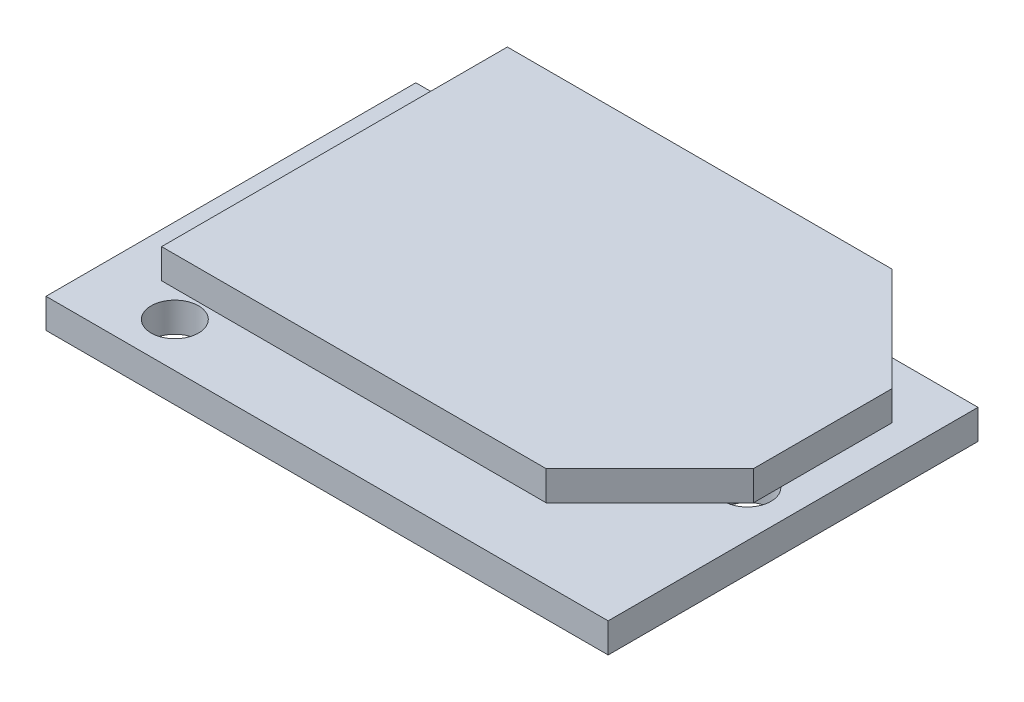
ISO-10303-21;
HEADER;
FILE_DESCRIPTION(('STEP AP214'),'2;1');
FILE_NAME('part.step','',(''),(''),'','','');
FILE_SCHEMA(('AUTOMOTIVE_DESIGN { 1 0 10303 214 1 1 1 1 }'));
ENDSEC;
DATA;
#1=APPLICATION_CONTEXT('core data for automotive mechanical design processes');
#2=APPLICATION_PROTOCOL_DEFINITION('international standard','automotive_design',2000,#1);
#3=PRODUCT_CONTEXT('',#1,'mechanical');
#4=PRODUCT('Part','Part','',(#3));
#5=PRODUCT_RELATED_PRODUCT_CATEGORY('part','',(#4));
#6=PRODUCT_DEFINITION_FORMATION('','',#4);
#7=PRODUCT_DEFINITION_CONTEXT('part definition',#1,'design');
#8=PRODUCT_DEFINITION('design','',#6,#7);
#9=PRODUCT_DEFINITION_SHAPE('','',#8);
#10=(LENGTH_UNIT() NAMED_UNIT(*) SI_UNIT(.MILLI.,.METRE.));
#11=(NAMED_UNIT(*) PLANE_ANGLE_UNIT() SI_UNIT($,.RADIAN.));
#12=(NAMED_UNIT(*) SI_UNIT($,.STERADIAN.) SOLID_ANGLE_UNIT());
#13=UNCERTAINTY_MEASURE_WITH_UNIT(LENGTH_MEASURE(1.E-05),#10,'distance_accuracy_value','');
#14=(GEOMETRIC_REPRESENTATION_CONTEXT(3) GLOBAL_UNCERTAINTY_ASSIGNED_CONTEXT((#13)) GLOBAL_UNIT_ASSIGNED_CONTEXT((#10,
#11,#12)) REPRESENTATION_CONTEXT('',''));
#15=CARTESIAN_POINT('',(0.,0.,0.));
#16=DIRECTION('',(0.,0.,1.));
#17=DIRECTION('',(1.,0.,0.));
#18=AXIS2_PLACEMENT_3D('',#15,#16,#17);
#19=CARTESIAN_POINT('',(7.,8.,-11.6864188731344));
#20=DIRECTION('',(1.,0.,0.));
#21=DIRECTION('',(0.,0.,-1.));
#22=AXIS2_PLACEMENT_3D('',#19,#20,#21);
#23=PLANE('',#22);
#24=DIRECTION('',(0.,0.,1.));
#25=VECTOR('',#24,1.);
#26=CARTESIAN_POINT('',(7.,6.,-11.6864188731344));
#27=LINE('',#26,#25);
#28=CARTESIAN_POINT('',(7.,6.,-11.6864188731344));
#29=VERTEX_POINT('',#28);
#30=CARTESIAN_POINT('',(7.,6.,11.6864188731344));
#31=VERTEX_POINT('',#30);
#32=EDGE_CURVE('E127',#29,#31,#27,.T.);
#33=ORIENTED_EDGE('',*,*,#32,.T.);
#34=DIRECTION('',(0.,-1.,0.));
#35=VECTOR('',#34,1.);
#36=CARTESIAN_POINT('',(7.,8.,11.6864188731344));
#37=LINE('',#36,#35);
#38=CARTESIAN_POINT('',(7.,8.,11.6864188731344));
#39=VERTEX_POINT('',#38);
#40=EDGE_CURVE('E12',#39,#31,#37,.T.);
#41=ORIENTED_EDGE('',*,*,#40,.F.);
#42=DIRECTION('',(0.,0.,1.));
#43=VECTOR('',#42,1.);
#44=CARTESIAN_POINT('',(7.,8.,-11.6864188731344));
#45=LINE('',#44,#43);
#46=CARTESIAN_POINT('',(7.,8.,-11.6864188731344));
#47=VERTEX_POINT('',#46);
#48=EDGE_CURVE('E137',#47,#39,#45,.T.);
#49=ORIENTED_EDGE('',*,*,#48,.F.);
#50=DIRECTION('',(0.,-1.,0.));
#51=VECTOR('',#50,1.);
#52=CARTESIAN_POINT('',(7.,8.,-11.6864188731344));
#53=LINE('',#52,#51);
#54=EDGE_CURVE('E123',#47,#29,#53,.T.);
#55=ORIENTED_EDGE('',*,*,#54,.T.);
#56=EDGE_LOOP('',(#33,#41,#49,#55));
#57=FACE_BOUND('',#56,.T.);
#58=ADVANCED_FACE('F43',(#57),#23,.F.);
#59=CARTESIAN_POINT('',(7.,8.,11.6864188731344));
#60=DIRECTION('',(0.,0.,-1.));
#61=DIRECTION('',(-1.,0.,0.));
#62=AXIS2_PLACEMENT_3D('',#59,#60,#61);
#63=PLANE('',#62);
#64=DIRECTION('',(1.,0.,0.));
#65=VECTOR('',#64,1.);
#66=CARTESIAN_POINT('',(7.,6.,11.6864188731344));
#67=LINE('',#66,#65);
#68=CARTESIAN_POINT('',(33.0000000000001,6.,11.6864188731344));
#69=VERTEX_POINT('',#68);
#70=EDGE_CURVE('E130',#31,#69,#67,.T.);
#71=ORIENTED_EDGE('',*,*,#70,.T.);
#72=DIRECTION('',(0.,-1.,0.));
#73=VECTOR('',#72,1.);
#74=CARTESIAN_POINT('',(33.0000000000001,8.,11.6864188731344));
#75=LINE('',#74,#73);
#76=CARTESIAN_POINT('',(33.0000000000001,8.,11.6864188731344));
#77=VERTEX_POINT('',#76);
#78=EDGE_CURVE('E51',#77,#69,#75,.T.);
#79=ORIENTED_EDGE('',*,*,#78,.F.);
#80=DIRECTION('',(1.,0.,0.));
#81=VECTOR('',#80,1.);
#82=CARTESIAN_POINT('',(7.,8.,11.6864188731344));
#83=LINE('',#82,#81);
#84=EDGE_CURVE('E96',#39,#77,#83,.T.);
#85=ORIENTED_EDGE('',*,*,#84,.F.);
#86=ORIENTED_EDGE('',*,*,#40,.T.);
#87=EDGE_LOOP('',(#71,#79,#85,#86));
#88=FACE_BOUND('',#87,.T.);
#89=ADVANCED_FACE('F161',(#88),#63,.F.);
#90=CARTESIAN_POINT('',(33.0000000000001,8.,11.6864188731344));
#91=DIRECTION('',(-0.707106781186549,0.,-0.707106781186546));
#92=DIRECTION('',(-0.707106781186546,0.,0.707106781186549));
#93=AXIS2_PLACEMENT_3D('',#90,#91,#92);
#94=PLANE('',#93);
#95=DIRECTION('',(0.707106781186546,0.,-0.707106781186549));
#96=VECTOR('',#95,1.);
#97=CARTESIAN_POINT('',(33.0000000000001,6.,11.6864188731344));
#98=LINE('',#97,#96);
#99=CARTESIAN_POINT('',(40.,6.,4.68641887313448));
#100=VERTEX_POINT('',#99);
#101=EDGE_CURVE('E132',#69,#100,#98,.T.);
#102=ORIENTED_EDGE('',*,*,#101,.T.);
#103=DIRECTION('',(0.,-1.,0.));
#104=VECTOR('',#103,1.);
#105=CARTESIAN_POINT('',(40.,8.,4.68641887313448));
#106=LINE('',#105,#104);
#107=CARTESIAN_POINT('',(40.,8.,4.68641887313448));
#108=VERTEX_POINT('',#107);
#109=EDGE_CURVE('E118',#108,#100,#106,.T.);
#110=ORIENTED_EDGE('',*,*,#109,.F.);
#111=DIRECTION('',(0.707106781186546,0.,-0.707106781186549));
#112=VECTOR('',#111,1.);
#113=CARTESIAN_POINT('',(33.0000000000001,8.,11.6864188731344));
#114=LINE('',#113,#112);
#115=EDGE_CURVE('E109',#77,#108,#114,.T.);
#116=ORIENTED_EDGE('',*,*,#115,.F.);
#117=ORIENTED_EDGE('',*,*,#78,.T.);
#118=EDGE_LOOP('',(#102,#110,#116,#117));
#119=FACE_BOUND('',#118,.T.);
#120=ADVANCED_FACE('F143',(#119),#94,.F.);
#121=CARTESIAN_POINT('',(40.,8.,4.68641887313448));
#122=DIRECTION('',(-1.,0.,0.));
#123=DIRECTION('',(0.,0.,1.));
#124=AXIS2_PLACEMENT_3D('',#121,#122,#123);
#125=PLANE('',#124);
#126=DIRECTION('',(0.,0.,-1.));
#127=VECTOR('',#126,1.);
#128=CARTESIAN_POINT('',(40.,6.,4.68641887313448));
#129=LINE('',#128,#127);
#130=CARTESIAN_POINT('',(40.,6.,-4.68641887313448));
#131=VERTEX_POINT('',#130);
#132=EDGE_CURVE('E117',#100,#131,#129,.T.);
#133=ORIENTED_EDGE('',*,*,#132,.T.);
#134=DIRECTION('',(0.,-1.,0.));
#135=VECTOR('',#134,1.);
#136=CARTESIAN_POINT('',(40.,8.,-4.68641887313448));
#137=LINE('',#136,#135);
#138=CARTESIAN_POINT('',(40.,8.,-4.68641887313448));
#139=VERTEX_POINT('',#138);
#140=EDGE_CURVE('E114',#139,#131,#137,.T.);
#141=ORIENTED_EDGE('',*,*,#140,.F.);
#142=DIRECTION('',(0.,0.,-1.));
#143=VECTOR('',#142,1.);
#144=CARTESIAN_POINT('',(40.,8.,4.68641887313448));
#145=LINE('',#144,#143);
#146=EDGE_CURVE('E103',#108,#139,#145,.T.);
#147=ORIENTED_EDGE('',*,*,#146,.F.);
#148=ORIENTED_EDGE('',*,*,#109,.T.);
#149=EDGE_LOOP('',(#133,#141,#147,#148));
#150=FACE_BOUND('',#149,.T.);
#151=ADVANCED_FACE('F115',(#150),#125,.F.);
#152=CARTESIAN_POINT('',(40.,8.,-4.68641887313448));
#153=DIRECTION('',(-0.707106781186544,0.,0.707106781186551));
#154=DIRECTION('',(0.707106781186551,0.,0.707106781186544));
#155=AXIS2_PLACEMENT_3D('',#152,#153,#154);
#156=PLANE('',#155);
#157=DIRECTION('',(-0.707106781186551,0.,-0.707106781186544));
#158=VECTOR('',#157,1.);
#159=CARTESIAN_POINT('',(40.,6.,-4.68641887313448));
#160=LINE('',#159,#158);
#161=CARTESIAN_POINT('',(33.,6.,-11.6864188731344));
#162=VERTEX_POINT('',#161);
#163=EDGE_CURVE('E82',#131,#162,#160,.T.);
#164=ORIENTED_EDGE('',*,*,#163,.T.);
#165=DIRECTION('',(0.,-1.,0.));
#166=VECTOR('',#165,1.);
#167=CARTESIAN_POINT('',(33.,8.,-11.6864188731344));
#168=LINE('',#167,#166);
#169=CARTESIAN_POINT('',(33.,8.,-11.6864188731344));
#170=VERTEX_POINT('',#169);
#171=EDGE_CURVE('E119',#170,#162,#168,.T.);
#172=ORIENTED_EDGE('',*,*,#171,.F.);
#173=DIRECTION('',(-0.707106781186551,0.,-0.707106781186544));
#174=VECTOR('',#173,1.);
#175=CARTESIAN_POINT('',(40.,8.,-4.68641887313448));
#176=LINE('',#175,#174);
#177=EDGE_CURVE('E107',#139,#170,#176,.T.);
#178=ORIENTED_EDGE('',*,*,#177,.F.);
#179=ORIENTED_EDGE('',*,*,#140,.T.);
#180=EDGE_LOOP('',(#164,#172,#178,#179));
#181=FACE_BOUND('',#180,.T.);
#182=ADVANCED_FACE('F121',(#181),#156,.F.);
#183=CARTESIAN_POINT('',(7.,8.,-11.6864188731344));
#184=DIRECTION('',(0.,0.,1.));
#185=DIRECTION('',(1.,0.,0.));
#186=AXIS2_PLACEMENT_3D('',#183,#184,#185);
#187=PLANE('',#186);
#188=DIRECTION('',(-1.,0.,0.));
#189=VECTOR('',#188,1.);
#190=CARTESIAN_POINT('',(7.,6.,-11.6864188731344));
#191=LINE('',#190,#189);
#192=EDGE_CURVE('E88',#162,#29,#191,.T.);
#193=ORIENTED_EDGE('',*,*,#192,.T.);
#194=ORIENTED_EDGE('',*,*,#54,.F.);
#195=DIRECTION('',(-1.,0.,0.));
#196=VECTOR('',#195,1.);
#197=CARTESIAN_POINT('',(7.,8.,-11.6864188731344));
#198=LINE('',#197,#196);
#199=EDGE_CURVE('E59',#170,#47,#198,.T.);
#200=ORIENTED_EDGE('',*,*,#199,.F.);
#201=ORIENTED_EDGE('',*,*,#171,.T.);
#202=EDGE_LOOP('',(#193,#194,#200,#201));
#203=FACE_BOUND('',#202,.T.);
#204=ADVANCED_FACE('F150',(#203),#187,.F.);
#205=CARTESIAN_POINT('',(0.,8.,0.));
#206=DIRECTION('',(0.,1.,0.));
#207=DIRECTION('',(0.,0.,1.));
#208=AXIS2_PLACEMENT_3D('',#205,#206,#207);
#209=PLANE('',#208);
#210=ORIENTED_EDGE('',*,*,#48,.T.);
#211=ORIENTED_EDGE('',*,*,#84,.T.);
#212=ORIENTED_EDGE('',*,*,#115,.T.);
#213=ORIENTED_EDGE('',*,*,#146,.T.);
#214=ORIENTED_EDGE('',*,*,#177,.T.);
#215=ORIENTED_EDGE('',*,*,#199,.T.);
#216=EDGE_LOOP('',(#210,#211,#212,#213,#214,#215));
#217=FACE_BOUND('',#216,.T.);
#218=ADVANCED_FACE('F105',(#217),#209,.T.);
#219=CARTESIAN_POINT('',(0.,6.,0.));
#220=DIRECTION('',(0.,1.,0.));
#221=DIRECTION('',(0.,0.,1.));
#222=AXIS2_PLACEMENT_3D('',#219,#220,#221);
#223=PLANE('',#222);
#224=ORIENTED_EDGE('',*,*,#32,.F.);
#225=ORIENTED_EDGE('',*,*,#192,.F.);
#226=ORIENTED_EDGE('',*,*,#163,.F.);
#227=ORIENTED_EDGE('',*,*,#132,.F.);
#228=ORIENTED_EDGE('',*,*,#101,.F.);
#229=ORIENTED_EDGE('',*,*,#70,.F.);
#230=EDGE_LOOP('',(#224,#225,#226,#227,#228,#229));
#231=FACE_BOUND('',#230,.T.);
#232=ADVANCED_FACE('F146',(#231),#223,.F.);
#233=CLOSED_SHELL('',(#58,#89,#120,#151,#182,#204,#218,#232));
#234=MANIFOLD_SOLID_BREP('B2',#233);
#235=CARTESIAN_POINT('',(0.,2.,0.));
#236=DIRECTION('',(0.,1.,0.));
#237=DIRECTION('',(0.,0.,1.));
#238=AXIS2_PLACEMENT_3D('',#235,#236,#237);
#239=PLANE('',#238);
#240=CARTESIAN_POINT('',(5.71,2.,9.5));
#241=DIRECTION('',(0.,1.,0.));
#242=DIRECTION('',(0.,0.,-1.));
#243=AXIS2_PLACEMENT_3D('',#240,#241,#242);
#244=CIRCLE('',#243,1.6);
#245=CARTESIAN_POINT('',(5.71,2.,7.9));
#246=VERTEX_POINT('',#245);
#247=EDGE_CURVE('E301',#246,#246,#244,.T.);
#248=ORIENTED_EDGE('',*,*,#247,.F.);
#249=EDGE_LOOP('',(#248));
#250=FACE_BOUND('',#249,.T.);
#251=DIRECTION('',(0.,0.,1.));
#252=VECTOR('',#251,1.);
#253=CARTESIAN_POINT('',(0.,2.,-12.5));
#254=LINE('',#253,#252);
#255=CARTESIAN_POINT('',(0.,2.,-12.5));
#256=VERTEX_POINT('',#255);
#257=CARTESIAN_POINT('',(0.,2.,12.5));
#258=VERTEX_POINT('',#257);
#259=EDGE_CURVE('E271',#256,#258,#254,.T.);
#260=ORIENTED_EDGE('',*,*,#259,.T.);
#261=DIRECTION('',(1.,0.,0.));
#262=VECTOR('',#261,1.);
#263=CARTESIAN_POINT('',(0.,2.,12.5));
#264=LINE('',#263,#262);
#265=CARTESIAN_POINT('',(38.,2.,12.5));
#266=VERTEX_POINT('',#265);
#267=EDGE_CURVE('E266',#258,#266,#264,.T.);
#268=ORIENTED_EDGE('',*,*,#267,.T.);
#269=DIRECTION('',(0.,0.,-1.));
#270=VECTOR('',#269,1.);
#271=CARTESIAN_POINT('',(38.,2.,-12.5));
#272=LINE('',#271,#270);
#273=CARTESIAN_POINT('',(38.,2.,-12.5));
#274=VERTEX_POINT('',#273);
#275=EDGE_CURVE('E269',#266,#274,#272,.T.);
#276=ORIENTED_EDGE('',*,*,#275,.T.);
#277=DIRECTION('',(-1.,0.,0.));
#278=VECTOR('',#277,1.);
#279=CARTESIAN_POINT('',(0.,2.,-12.5));
#280=LINE('',#279,#278);
#281=EDGE_CURVE('E236',#274,#256,#280,.T.);
#282=ORIENTED_EDGE('',*,*,#281,.T.);
#283=EDGE_LOOP('',(#260,#268,#276,#282));
#284=FACE_BOUND('',#283,.T.);
#285=CARTESIAN_POINT('',(5.71,2.,-9.5));
#286=DIRECTION('',(0.,1.,0.));
#287=DIRECTION('',(0.,0.,1.));
#288=AXIS2_PLACEMENT_3D('',#285,#286,#287);
#289=CIRCLE('',#288,1.6);
#290=CARTESIAN_POINT('',(5.71,2.,-7.9));
#291=VERTEX_POINT('',#290);
#292=EDGE_CURVE('E286',#291,#291,#289,.T.);
#293=ORIENTED_EDGE('',*,*,#292,.F.);
#294=EDGE_LOOP('',(#293));
#295=FACE_BOUND('',#294,.T.);
#296=CARTESIAN_POINT('',(34.91,2.,0.));
#297=DIRECTION('',(0.,1.,0.));
#298=DIRECTION('',(0.,0.,1.));
#299=AXIS2_PLACEMENT_3D('',#296,#297,#298);
#300=CIRCLE('',#299,1.6);
#301=CARTESIAN_POINT('',(34.91,2.,1.6));
#302=VERTEX_POINT('',#301);
#303=EDGE_CURVE('E307',#302,#302,#300,.T.);
#304=ORIENTED_EDGE('',*,*,#303,.F.);
#305=EDGE_LOOP('',(#304));
#306=FACE_BOUND('',#305,.T.);
#307=ADVANCED_FACE('F219',(#250,#284,#295,#306),#239,.T.);
#308=CARTESIAN_POINT('',(0.,0.,0.));
#309=DIRECTION('',(0.,1.,0.));
#310=DIRECTION('',(0.,0.,1.));
#311=AXIS2_PLACEMENT_3D('',#308,#309,#310);
#312=PLANE('',#311);
#313=DIRECTION('',(0.,0.,1.));
#314=VECTOR('',#313,1.);
#315=CARTESIAN_POINT('',(0.,0.,-12.5));
#316=LINE('',#315,#314);
#317=CARTESIAN_POINT('',(0.,0.,-12.5));
#318=VERTEX_POINT('',#317);
#319=CARTESIAN_POINT('',(0.,0.,12.5));
#320=VERTEX_POINT('',#319);
#321=EDGE_CURVE('E283',#318,#320,#316,.T.);
#322=ORIENTED_EDGE('',*,*,#321,.F.);
#323=DIRECTION('',(-1.,0.,0.));
#324=VECTOR('',#323,1.);
#325=CARTESIAN_POINT('',(0.,0.,-12.5));
#326=LINE('',#325,#324);
#327=CARTESIAN_POINT('',(38.,0.,-12.5));
#328=VERTEX_POINT('',#327);
#329=EDGE_CURVE('E259',#328,#318,#326,.T.);
#330=ORIENTED_EDGE('',*,*,#329,.F.);
#331=DIRECTION('',(0.,0.,-1.));
#332=VECTOR('',#331,1.);
#333=CARTESIAN_POINT('',(38.,0.,-12.5));
#334=LINE('',#333,#332);
#335=CARTESIAN_POINT('',(38.,0.,12.5));
#336=VERTEX_POINT('',#335);
#337=EDGE_CURVE('E253',#336,#328,#334,.T.);
#338=ORIENTED_EDGE('',*,*,#337,.F.);
#339=DIRECTION('',(1.,0.,0.));
#340=VECTOR('',#339,1.);
#341=CARTESIAN_POINT('',(0.,0.,12.5));
#342=LINE('',#341,#340);
#343=EDGE_CURVE('E275',#320,#336,#342,.T.);
#344=ORIENTED_EDGE('',*,*,#343,.F.);
#345=EDGE_LOOP('',(#322,#330,#338,#344));
#346=FACE_BOUND('',#345,.T.);
#347=CARTESIAN_POINT('',(5.71,0.,-9.5));
#348=DIRECTION('',(0.,1.,0.));
#349=DIRECTION('',(0.,0.,1.));
#350=AXIS2_PLACEMENT_3D('',#347,#348,#349);
#351=CIRCLE('',#350,1.6);
#352=CARTESIAN_POINT('',(5.71,0.,-7.9));
#353=VERTEX_POINT('',#352);
#354=EDGE_CURVE('E298',#353,#353,#351,.T.);
#355=ORIENTED_EDGE('',*,*,#354,.T.);
#356=EDGE_LOOP('',(#355));
#357=FACE_BOUND('',#356,.T.);
#358=CARTESIAN_POINT('',(5.71,0.,9.5));
#359=DIRECTION('',(0.,1.,0.));
#360=DIRECTION('',(0.,0.,-1.));
#361=AXIS2_PLACEMENT_3D('',#358,#359,#360);
#362=CIRCLE('',#361,1.6);
#363=CARTESIAN_POINT('',(5.71,0.,7.9));
#364=VERTEX_POINT('',#363);
#365=EDGE_CURVE('E304',#364,#364,#362,.T.);
#366=ORIENTED_EDGE('',*,*,#365,.T.);
#367=EDGE_LOOP('',(#366));
#368=FACE_BOUND('',#367,.T.);
#369=CARTESIAN_POINT('',(34.91,0.,0.));
#370=DIRECTION('',(0.,1.,0.));
#371=DIRECTION('',(0.,0.,1.));
#372=AXIS2_PLACEMENT_3D('',#369,#370,#371);
#373=CIRCLE('',#372,1.6);
#374=CARTESIAN_POINT('',(34.91,0.,1.6));
#375=VERTEX_POINT('',#374);
#376=EDGE_CURVE('E310',#375,#375,#373,.T.);
#377=ORIENTED_EDGE('',*,*,#376,.T.);
#378=EDGE_LOOP('',(#377));
#379=FACE_BOUND('',#378,.T.);
#380=ADVANCED_FACE('F294',(#346,#357,#368,#379),#312,.F.);
#381=CARTESIAN_POINT('',(0.,2.,-12.5));
#382=DIRECTION('',(1.,0.,0.));
#383=DIRECTION('',(0.,0.,-1.));
#384=AXIS2_PLACEMENT_3D('',#381,#382,#383);
#385=PLANE('',#384);
#386=ORIENTED_EDGE('',*,*,#321,.T.);
#387=DIRECTION('',(0.,-1.,0.));
#388=VECTOR('',#387,1.);
#389=CARTESIAN_POINT('',(0.,2.,12.5));
#390=LINE('',#389,#388);
#391=EDGE_CURVE('E41',#258,#320,#390,.T.);
#392=ORIENTED_EDGE('',*,*,#391,.F.);
#393=ORIENTED_EDGE('',*,*,#259,.F.);
#394=DIRECTION('',(0.,-1.,0.));
#395=VECTOR('',#394,1.);
#396=CARTESIAN_POINT('',(0.,2.,-12.5));
#397=LINE('',#396,#395);
#398=EDGE_CURVE('E279',#256,#318,#397,.T.);
#399=ORIENTED_EDGE('',*,*,#398,.T.);
#400=EDGE_LOOP('',(#386,#392,#393,#399));
#401=FACE_BOUND('',#400,.T.);
#402=ADVANCED_FACE('F221',(#401),#385,.F.);
#403=CARTESIAN_POINT('',(0.,2.,12.5));
#404=DIRECTION('',(0.,0.,-1.));
#405=DIRECTION('',(-1.,0.,0.));
#406=AXIS2_PLACEMENT_3D('',#403,#404,#405);
#407=PLANE('',#406);
#408=ORIENTED_EDGE('',*,*,#343,.T.);
#409=DIRECTION('',(0.,-1.,0.));
#410=VECTOR('',#409,1.);
#411=CARTESIAN_POINT('',(38.,2.,12.5));
#412=LINE('',#411,#410);
#413=EDGE_CURVE('E228',#266,#336,#412,.T.);
#414=ORIENTED_EDGE('',*,*,#413,.F.);
#415=ORIENTED_EDGE('',*,*,#267,.F.);
#416=ORIENTED_EDGE('',*,*,#391,.T.);
#417=EDGE_LOOP('',(#408,#414,#415,#416));
#418=FACE_BOUND('',#417,.T.);
#419=ADVANCED_FACE('F274',(#418),#407,.F.);
#420=CARTESIAN_POINT('',(38.,2.,-12.5));
#421=DIRECTION('',(-1.,0.,0.));
#422=DIRECTION('',(0.,0.,1.));
#423=AXIS2_PLACEMENT_3D('',#420,#421,#422);
#424=PLANE('',#423);
#425=ORIENTED_EDGE('',*,*,#337,.T.);
#426=DIRECTION('',(0.,-1.,0.));
#427=VECTOR('',#426,1.);
#428=CARTESIAN_POINT('',(38.,2.,-12.5));
#429=LINE('',#428,#427);
#430=EDGE_CURVE('E276',#274,#328,#429,.T.);
#431=ORIENTED_EDGE('',*,*,#430,.F.);
#432=ORIENTED_EDGE('',*,*,#275,.F.);
#433=ORIENTED_EDGE('',*,*,#413,.T.);
#434=EDGE_LOOP('',(#425,#431,#432,#433));
#435=FACE_BOUND('',#434,.T.);
#436=ADVANCED_FACE('F277',(#435),#424,.F.);
#437=CARTESIAN_POINT('',(0.,2.,-12.5));
#438=DIRECTION('',(0.,0.,1.));
#439=DIRECTION('',(1.,0.,0.));
#440=AXIS2_PLACEMENT_3D('',#437,#438,#439);
#441=PLANE('',#440);
#442=ORIENTED_EDGE('',*,*,#329,.T.);
#443=ORIENTED_EDGE('',*,*,#398,.F.);
#444=ORIENTED_EDGE('',*,*,#281,.F.);
#445=ORIENTED_EDGE('',*,*,#430,.T.);
#446=EDGE_LOOP('',(#442,#443,#444,#445));
#447=FACE_BOUND('',#446,.T.);
#448=ADVANCED_FACE('F291',(#447),#441,.F.);
#449=CARTESIAN_POINT('',(5.71,2.,-9.5));
#450=DIRECTION('',(0.,-1.,0.));
#451=DIRECTION('',(0.,0.,-1.));
#452=AXIS2_PLACEMENT_3D('',#449,#450,#451);
#453=CYLINDRICAL_SURFACE('',#452,1.6);
#454=ORIENTED_EDGE('',*,*,#292,.T.);
#455=EDGE_LOOP('',(#454));
#456=FACE_BOUND('',#455,.T.);
#457=ORIENTED_EDGE('',*,*,#354,.F.);
#458=EDGE_LOOP('',(#457));
#459=FACE_BOUND('',#458,.T.);
#460=ADVANCED_FACE('F328',(#456,#459),#453,.F.);
#461=CARTESIAN_POINT('',(5.71,2.,9.5));
#462=DIRECTION('',(0.,-1.,0.));
#463=DIRECTION('',(0.,0.,-1.));
#464=AXIS2_PLACEMENT_3D('',#461,#462,#463);
#465=CYLINDRICAL_SURFACE('',#464,1.6);
#466=ORIENTED_EDGE('',*,*,#247,.T.);
#467=EDGE_LOOP('',(#466));
#468=FACE_BOUND('',#467,.T.);
#469=ORIENTED_EDGE('',*,*,#365,.F.);
#470=EDGE_LOOP('',(#469));
#471=FACE_BOUND('',#470,.T.);
#472=ADVANCED_FACE('F374',(#468,#471),#465,.F.);
#473=CARTESIAN_POINT('',(34.91,2.,0.));
#474=DIRECTION('',(0.,-1.,0.));
#475=DIRECTION('',(0.,0.,-1.));
#476=AXIS2_PLACEMENT_3D('',#473,#474,#475);
#477=CYLINDRICAL_SURFACE('',#476,1.6);
#478=ORIENTED_EDGE('',*,*,#303,.T.);
#479=EDGE_LOOP('',(#478));
#480=FACE_BOUND('',#479,.T.);
#481=ORIENTED_EDGE('',*,*,#376,.F.);
#482=EDGE_LOOP('',(#481));
#483=FACE_BOUND('',#482,.T.);
#484=ADVANCED_FACE('F316',(#480,#483),#477,.F.);
#485=CLOSED_SHELL('',(#307,#380,#402,#419,#436,#448,#460,#472,#484));
#486=MANIFOLD_SOLID_BREP('B6',#485);
#487=ADVANCED_BREP_SHAPE_REPRESENTATION('',(#18,#234,#486),#14);
#488=SHAPE_DEFINITION_REPRESENTATION(#9,#487);
ENDSEC;
END-ISO-10303-21;
